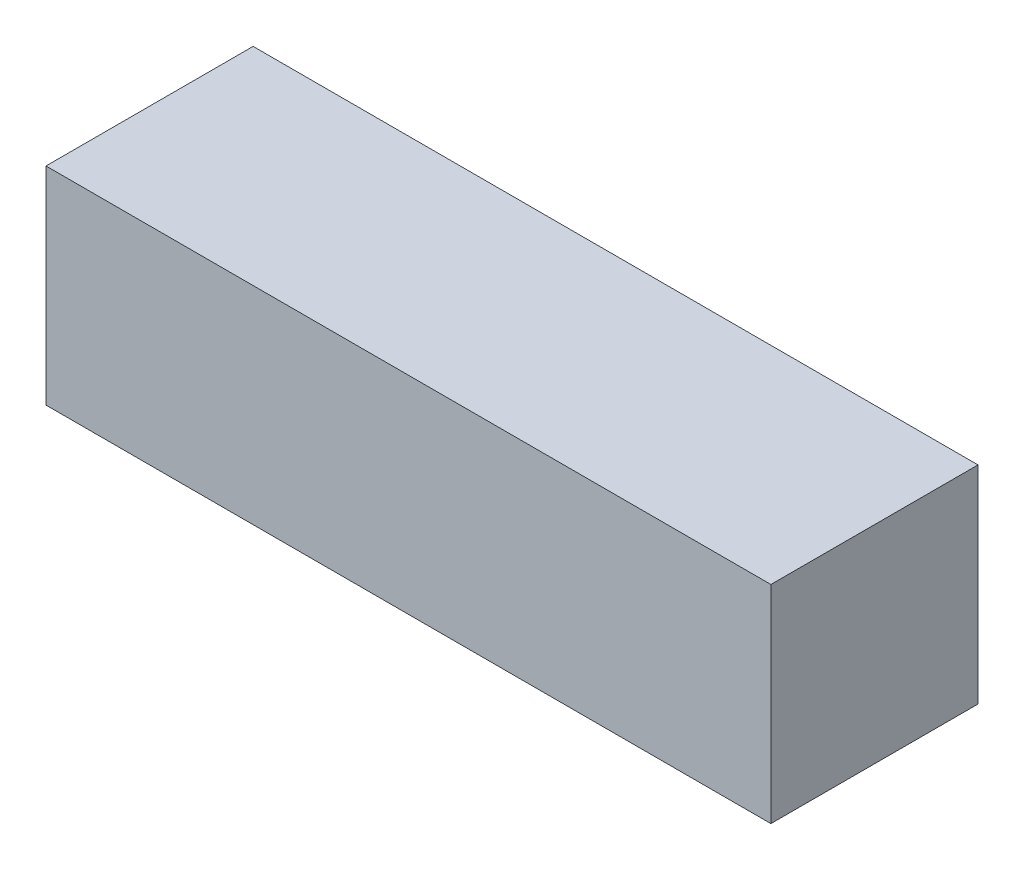
ISO-10303-21;
HEADER;
FILE_DESCRIPTION(('STEP AP214'),'2;1');
FILE_NAME('part.step','',(''),(''),'','','');
FILE_SCHEMA(('AUTOMOTIVE_DESIGN { 1 0 10303 214 1 1 1 1 }'));
ENDSEC;
DATA;
#1=APPLICATION_CONTEXT('core data for automotive mechanical design processes');
#2=APPLICATION_PROTOCOL_DEFINITION('international standard','automotive_design',2000,#1);
#3=PRODUCT_CONTEXT('',#1,'mechanical');
#4=PRODUCT('Part','Part','',(#3));
#5=PRODUCT_RELATED_PRODUCT_CATEGORY('part','',(#4));
#6=PRODUCT_DEFINITION_FORMATION('','',#4);
#7=PRODUCT_DEFINITION_CONTEXT('part definition',#1,'design');
#8=PRODUCT_DEFINITION('design','',#6,#7);
#9=PRODUCT_DEFINITION_SHAPE('','',#8);
#10=(LENGTH_UNIT() NAMED_UNIT(*) SI_UNIT(.MILLI.,.METRE.));
#11=(NAMED_UNIT(*) PLANE_ANGLE_UNIT() SI_UNIT($,.RADIAN.));
#12=(NAMED_UNIT(*) SI_UNIT($,.STERADIAN.) SOLID_ANGLE_UNIT());
#13=UNCERTAINTY_MEASURE_WITH_UNIT(LENGTH_MEASURE(1.E-05),#10,'distance_accuracy_value','');
#14=(GEOMETRIC_REPRESENTATION_CONTEXT(3) GLOBAL_UNCERTAINTY_ASSIGNED_CONTEXT((#13)) GLOBAL_UNIT_ASSIGNED_CONTEXT((#10,
#11,#12)) REPRESENTATION_CONTEXT('',''));
#15=CARTESIAN_POINT('',(0.,0.,0.));
#16=DIRECTION('',(0.,0.,1.));
#17=DIRECTION('',(1.,0.,0.));
#18=AXIS2_PLACEMENT_3D('',#15,#16,#17);
#19=CARTESIAN_POINT('',(0.,50.8,0.));
#20=DIRECTION('',(1.,0.,0.));
#21=DIRECTION('',(0.,0.,-1.));
#22=AXIS2_PLACEMENT_3D('',#19,#20,#21);
#23=PLANE('',#22);
#24=DIRECTION('',(0.,0.,1.));
#25=VECTOR('',#24,1.);
#26=CARTESIAN_POINT('',(0.,0.,0.));
#27=LINE('',#26,#25);
#28=CARTESIAN_POINT('',(0.,0.,-50.8));
#29=VERTEX_POINT('',#28);
#30=CARTESIAN_POINT('',(0.,0.,0.));
#31=VERTEX_POINT('',#30);
#32=EDGE_CURVE('E96',#29,#31,#27,.T.);
#33=ORIENTED_EDGE('',*,*,#32,.T.);
#34=DIRECTION('',(0.,-1.,0.));
#35=VECTOR('',#34,1.);
#36=CARTESIAN_POINT('',(0.,50.8,0.));
#37=LINE('',#36,#35);
#38=CARTESIAN_POINT('',(0.,50.8,0.));
#39=VERTEX_POINT('',#38);
#40=EDGE_CURVE('E11',#39,#31,#37,.T.);
#41=ORIENTED_EDGE('',*,*,#40,.F.);
#42=DIRECTION('',(0.,0.,1.));
#43=VECTOR('',#42,1.);
#44=CARTESIAN_POINT('',(0.,50.8,0.));
#45=LINE('',#44,#43);
#46=CARTESIAN_POINT('',(0.,50.8,-50.8));
#47=VERTEX_POINT('',#46);
#48=EDGE_CURVE('E84',#47,#39,#45,.T.);
#49=ORIENTED_EDGE('',*,*,#48,.F.);
#50=DIRECTION('',(0.,-1.,0.));
#51=VECTOR('',#50,1.);
#52=CARTESIAN_POINT('',(0.,50.8,-50.8));
#53=LINE('',#52,#51);
#54=EDGE_CURVE('E92',#47,#29,#53,.T.);
#55=ORIENTED_EDGE('',*,*,#54,.T.);
#56=EDGE_LOOP('',(#33,#41,#49,#55));
#57=FACE_BOUND('',#56,.T.);
#58=ADVANCED_FACE('F33',(#57),#23,.F.);
#59=CARTESIAN_POINT('',(0.,50.8,0.));
#60=DIRECTION('',(0.,0.,-1.));
#61=DIRECTION('',(-1.,0.,0.));
#62=AXIS2_PLACEMENT_3D('',#59,#60,#61);
#63=PLANE('',#62);
#64=DIRECTION('',(1.,0.,0.));
#65=VECTOR('',#64,1.);
#66=CARTESIAN_POINT('',(0.,0.,0.));
#67=LINE('',#66,#65);
#68=CARTESIAN_POINT('',(177.8,0.,0.));
#69=VERTEX_POINT('',#68);
#70=EDGE_CURVE('E88',#31,#69,#67,.T.);
#71=ORIENTED_EDGE('',*,*,#70,.T.);
#72=DIRECTION('',(0.,-1.,0.));
#73=VECTOR('',#72,1.);
#74=CARTESIAN_POINT('',(177.8,50.8,0.));
#75=LINE('',#74,#73);
#76=CARTESIAN_POINT('',(177.8,50.8,0.));
#77=VERTEX_POINT('',#76);
#78=EDGE_CURVE('E41',#77,#69,#75,.T.);
#79=ORIENTED_EDGE('',*,*,#78,.F.);
#80=DIRECTION('',(1.,0.,0.));
#81=VECTOR('',#80,1.);
#82=CARTESIAN_POINT('',(0.,50.8,0.));
#83=LINE('',#82,#81);
#84=EDGE_CURVE('E79',#39,#77,#83,.T.);
#85=ORIENTED_EDGE('',*,*,#84,.F.);
#86=ORIENTED_EDGE('',*,*,#40,.T.);
#87=EDGE_LOOP('',(#71,#79,#85,#86));
#88=FACE_BOUND('',#87,.T.);
#89=ADVANCED_FACE('F87',(#88),#63,.F.);
#90=CARTESIAN_POINT('',(177.8,50.8,0.));
#91=DIRECTION('',(-1.,0.,0.));
#92=DIRECTION('',(0.,0.,1.));
#93=AXIS2_PLACEMENT_3D('',#90,#91,#92);
#94=PLANE('',#93);
#95=DIRECTION('',(0.,0.,-1.));
#96=VECTOR('',#95,1.);
#97=CARTESIAN_POINT('',(177.8,0.,0.));
#98=LINE('',#97,#96);
#99=CARTESIAN_POINT('',(177.8,0.,-50.8));
#100=VERTEX_POINT('',#99);
#101=EDGE_CURVE('E66',#69,#100,#98,.T.);
#102=ORIENTED_EDGE('',*,*,#101,.T.);
#103=DIRECTION('',(0.,-1.,0.));
#104=VECTOR('',#103,1.);
#105=CARTESIAN_POINT('',(177.8,50.8,-50.8));
#106=LINE('',#105,#104);
#107=CARTESIAN_POINT('',(177.8,50.8,-50.8));
#108=VERTEX_POINT('',#107);
#109=EDGE_CURVE('E89',#108,#100,#106,.T.);
#110=ORIENTED_EDGE('',*,*,#109,.F.);
#111=DIRECTION('',(0.,0.,-1.));
#112=VECTOR('',#111,1.);
#113=CARTESIAN_POINT('',(177.8,50.8,0.));
#114=LINE('',#113,#112);
#115=EDGE_CURVE('E82',#77,#108,#114,.T.);
#116=ORIENTED_EDGE('',*,*,#115,.F.);
#117=ORIENTED_EDGE('',*,*,#78,.T.);
#118=EDGE_LOOP('',(#102,#110,#116,#117));
#119=FACE_BOUND('',#118,.T.);
#120=ADVANCED_FACE('F90',(#119),#94,.F.);
#121=CARTESIAN_POINT('',(0.,50.8,-50.8));
#122=DIRECTION('',(0.,0.,1.));
#123=DIRECTION('',(1.,0.,0.));
#124=AXIS2_PLACEMENT_3D('',#121,#122,#123);
#125=PLANE('',#124);
#126=DIRECTION('',(-1.,0.,0.));
#127=VECTOR('',#126,1.);
#128=CARTESIAN_POINT('',(0.,0.,-50.8));
#129=LINE('',#128,#127);
#130=EDGE_CURVE('E72',#100,#29,#129,.T.);
#131=ORIENTED_EDGE('',*,*,#130,.T.);
#132=ORIENTED_EDGE('',*,*,#54,.F.);
#133=DIRECTION('',(-1.,0.,0.));
#134=VECTOR('',#133,1.);
#135=CARTESIAN_POINT('',(0.,50.8,-50.8));
#136=LINE('',#135,#134);
#137=EDGE_CURVE('E49',#108,#47,#136,.T.);
#138=ORIENTED_EDGE('',*,*,#137,.F.);
#139=ORIENTED_EDGE('',*,*,#109,.T.);
#140=EDGE_LOOP('',(#131,#132,#138,#139));
#141=FACE_BOUND('',#140,.T.);
#142=ADVANCED_FACE('F103',(#141),#125,.F.);
#143=CARTESIAN_POINT('',(0.,50.8,0.));
#144=DIRECTION('',(0.,-1.,0.));
#145=DIRECTION('',(0.,0.,-1.));
#146=AXIS2_PLACEMENT_3D('',#143,#144,#145);
#147=PLANE('',#146);
#148=ORIENTED_EDGE('',*,*,#48,.T.);
#149=ORIENTED_EDGE('',*,*,#84,.T.);
#150=ORIENTED_EDGE('',*,*,#115,.T.);
#151=ORIENTED_EDGE('',*,*,#137,.T.);
#152=EDGE_LOOP('',(#148,#149,#150,#151));
#153=FACE_BOUND('',#152,.T.);
#154=ADVANCED_FACE('F80',(#153),#147,.F.);
#155=CARTESIAN_POINT('',(0.,0.,0.));
#156=DIRECTION('',(0.,-1.,0.));
#157=DIRECTION('',(0.,0.,-1.));
#158=AXIS2_PLACEMENT_3D('',#155,#156,#157);
#159=PLANE('',#158);
#160=ORIENTED_EDGE('',*,*,#32,.F.);
#161=ORIENTED_EDGE('',*,*,#130,.F.);
#162=ORIENTED_EDGE('',*,*,#101,.F.);
#163=ORIENTED_EDGE('',*,*,#70,.F.);
#164=EDGE_LOOP('',(#160,#161,#162,#163));
#165=FACE_BOUND('',#164,.T.);
#166=ADVANCED_FACE('F106',(#165),#159,.T.);
#167=CLOSED_SHELL('',(#58,#89,#120,#142,#154,#166));
#168=MANIFOLD_SOLID_BREP('B2',#167);
#169=ADVANCED_BREP_SHAPE_REPRESENTATION('',(#18,#168),#14);
#170=SHAPE_DEFINITION_REPRESENTATION(#9,#169);
ENDSEC;
END-ISO-10303-21;
